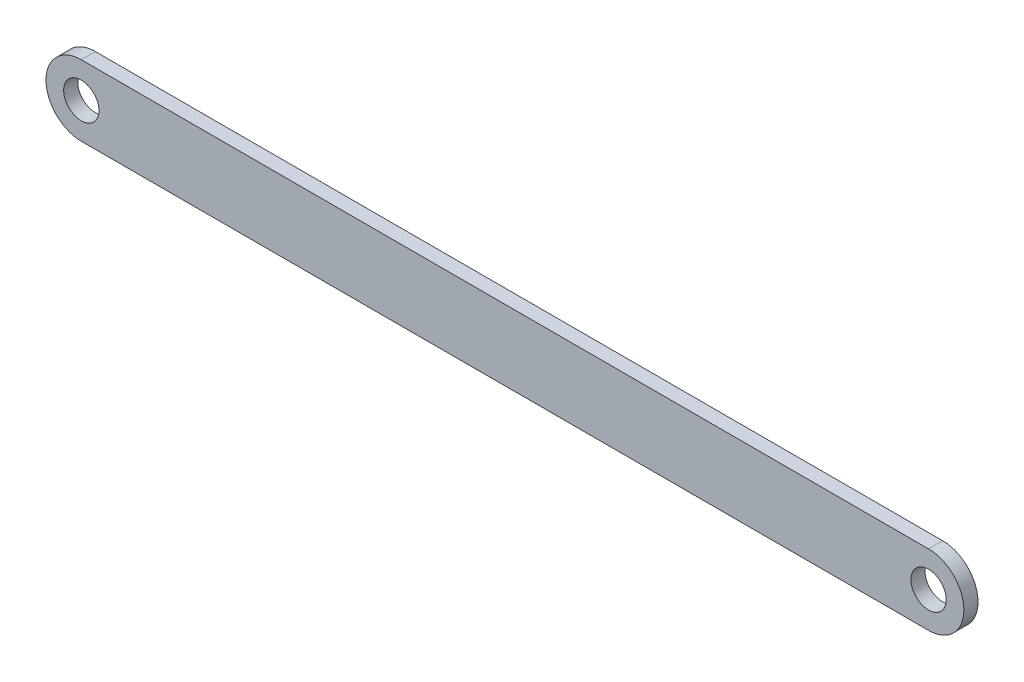
ISO-10303-21;
HEADER;
FILE_DESCRIPTION(('STEP AP214'),'2;1');
FILE_NAME('part.step','',(''),(''),'','','');
FILE_SCHEMA(('AUTOMOTIVE_DESIGN { 1 0 10303 214 1 1 1 1 }'));
ENDSEC;
DATA;
#1=APPLICATION_CONTEXT('core data for automotive mechanical design processes');
#2=APPLICATION_PROTOCOL_DEFINITION('international standard','automotive_design',2000,#1);
#3=PRODUCT_CONTEXT('',#1,'mechanical');
#4=PRODUCT('Part','Part','',(#3));
#5=PRODUCT_RELATED_PRODUCT_CATEGORY('part','',(#4));
#6=PRODUCT_DEFINITION_FORMATION('','',#4);
#7=PRODUCT_DEFINITION_CONTEXT('part definition',#1,'design');
#8=PRODUCT_DEFINITION('design','',#6,#7);
#9=PRODUCT_DEFINITION_SHAPE('','',#8);
#10=(LENGTH_UNIT() NAMED_UNIT(*) SI_UNIT(.MILLI.,.METRE.));
#11=(NAMED_UNIT(*) PLANE_ANGLE_UNIT() SI_UNIT($,.RADIAN.));
#12=(NAMED_UNIT(*) SI_UNIT($,.STERADIAN.) SOLID_ANGLE_UNIT());
#13=UNCERTAINTY_MEASURE_WITH_UNIT(LENGTH_MEASURE(1.E-05),#10,'distance_accuracy_value','');
#14=(GEOMETRIC_REPRESENTATION_CONTEXT(3) GLOBAL_UNCERTAINTY_ASSIGNED_CONTEXT((#13)) GLOBAL_UNIT_ASSIGNED_CONTEXT((#10,
#11,#12)) REPRESENTATION_CONTEXT('',''));
#15=CARTESIAN_POINT('',(0.,0.,0.));
#16=DIRECTION('',(0.,0.,1.));
#17=DIRECTION('',(1.,0.,0.));
#18=AXIS2_PLACEMENT_3D('',#15,#16,#17);
#19=CARTESIAN_POINT('',(76.2,0.,2.54));
#20=DIRECTION('',(0.,0.,1.));
#21=DIRECTION('',(1.,0.,0.));
#22=AXIS2_PLACEMENT_3D('',#19,#20,#21);
#23=PLANE('',#22);
#24=CARTESIAN_POINT('',(76.2,0.,2.54));
#25=DIRECTION('',(0.,0.,1.));
#26=DIRECTION('',(1.,0.,0.));
#27=AXIS2_PLACEMENT_3D('',#24,#25,#26);
#28=CIRCLE('',#27,3.175);
#29=CARTESIAN_POINT('',(79.375,0.,2.54));
#30=VERTEX_POINT('',#29);
#31=EDGE_CURVE('E100',#30,#30,#28,.T.);
#32=ORIENTED_EDGE('',*,*,#31,.F.);
#33=EDGE_LOOP('',(#32));
#34=FACE_BOUND('',#33,.T.);
#35=CARTESIAN_POINT('',(76.2,0.,2.54));
#36=DIRECTION('',(0.,0.,1.));
#37=DIRECTION('',(1.,0.,0.));
#38=AXIS2_PLACEMENT_3D('',#35,#36,#37);
#39=CIRCLE('',#38,6.35);
#40=CARTESIAN_POINT('',(76.2,-6.35,2.54));
#41=VERTEX_POINT('',#40);
#42=CARTESIAN_POINT('',(76.2,6.35,2.54));
#43=VERTEX_POINT('',#42);
#44=EDGE_CURVE('E85',#41,#43,#39,.T.);
#45=ORIENTED_EDGE('',*,*,#44,.T.);
#46=DIRECTION('',(-1.,0.,0.));
#47=VECTOR('',#46,1.);
#48=CARTESIAN_POINT('',(-76.2,6.35,2.54));
#49=LINE('',#48,#47);
#50=CARTESIAN_POINT('',(-76.2,6.35,2.54));
#51=VERTEX_POINT('',#50);
#52=EDGE_CURVE('E80',#43,#51,#49,.T.);
#53=ORIENTED_EDGE('',*,*,#52,.T.);
#54=CARTESIAN_POINT('',(-76.2,0.,2.54));
#55=DIRECTION('',(0.,0.,1.));
#56=DIRECTION('',(1.,0.,0.));
#57=AXIS2_PLACEMENT_3D('',#54,#55,#56);
#58=CIRCLE('',#57,6.35);
#59=CARTESIAN_POINT('',(-76.2,-6.35,2.54));
#60=VERTEX_POINT('',#59);
#61=EDGE_CURVE('E83',#51,#60,#58,.T.);
#62=ORIENTED_EDGE('',*,*,#61,.T.);
#63=DIRECTION('',(1.,0.,0.));
#64=VECTOR('',#63,1.);
#65=CARTESIAN_POINT('',(-76.2,-6.35,2.54));
#66=LINE('',#65,#64);
#67=EDGE_CURVE('E50',#60,#41,#66,.T.);
#68=ORIENTED_EDGE('',*,*,#67,.T.);
#69=EDGE_LOOP('',(#45,#53,#62,#68));
#70=FACE_BOUND('',#69,.T.);
#71=CARTESIAN_POINT('',(-76.2,0.,2.54));
#72=DIRECTION('',(0.,0.,1.));
#73=DIRECTION('',(1.,0.,0.));
#74=AXIS2_PLACEMENT_3D('',#71,#72,#73);
#75=CIRCLE('',#74,3.175);
#76=CARTESIAN_POINT('',(-73.025,0.,2.54));
#77=VERTEX_POINT('',#76);
#78=EDGE_CURVE('E115',#77,#77,#75,.T.);
#79=ORIENTED_EDGE('',*,*,#78,.F.);
#80=EDGE_LOOP('',(#79));
#81=FACE_BOUND('',#80,.T.);
#82=ADVANCED_FACE('F33',(#34,#70,#81),#23,.T.);
#83=CARTESIAN_POINT('',(76.2,0.,0.));
#84=DIRECTION('',(0.,0.,1.));
#85=DIRECTION('',(1.,0.,0.));
#86=AXIS2_PLACEMENT_3D('',#83,#84,#85);
#87=PLANE('',#86);
#88=CARTESIAN_POINT('',(76.2,0.,0.));
#89=DIRECTION('',(0.,0.,1.));
#90=DIRECTION('',(1.,0.,0.));
#91=AXIS2_PLACEMENT_3D('',#88,#89,#90);
#92=CIRCLE('',#91,6.35);
#93=CARTESIAN_POINT('',(76.2,-6.35,0.));
#94=VERTEX_POINT('',#93);
#95=CARTESIAN_POINT('',(76.2,6.35,0.));
#96=VERTEX_POINT('',#95);
#97=EDGE_CURVE('E97',#94,#96,#92,.T.);
#98=ORIENTED_EDGE('',*,*,#97,.F.);
#99=DIRECTION('',(1.,0.,0.));
#100=VECTOR('',#99,1.);
#101=CARTESIAN_POINT('',(-76.2,-6.35,0.));
#102=LINE('',#101,#100);
#103=CARTESIAN_POINT('',(-76.2,-6.35,0.));
#104=VERTEX_POINT('',#103);
#105=EDGE_CURVE('E73',#104,#94,#102,.T.);
#106=ORIENTED_EDGE('',*,*,#105,.F.);
#107=CARTESIAN_POINT('',(-76.2,0.,0.));
#108=DIRECTION('',(0.,0.,1.));
#109=DIRECTION('',(1.,0.,0.));
#110=AXIS2_PLACEMENT_3D('',#107,#108,#109);
#111=CIRCLE('',#110,6.35);
#112=CARTESIAN_POINT('',(-76.2,6.35,0.));
#113=VERTEX_POINT('',#112);
#114=EDGE_CURVE('E67',#113,#104,#111,.T.);
#115=ORIENTED_EDGE('',*,*,#114,.F.);
#116=DIRECTION('',(-1.,0.,0.));
#117=VECTOR('',#116,1.);
#118=CARTESIAN_POINT('',(-76.2,6.35,0.));
#119=LINE('',#118,#117);
#120=EDGE_CURVE('E89',#96,#113,#119,.T.);
#121=ORIENTED_EDGE('',*,*,#120,.F.);
#122=EDGE_LOOP('',(#98,#106,#115,#121));
#123=FACE_BOUND('',#122,.T.);
#124=CARTESIAN_POINT('',(76.2,0.,0.));
#125=DIRECTION('',(0.,0.,1.));
#126=DIRECTION('',(1.,0.,0.));
#127=AXIS2_PLACEMENT_3D('',#124,#125,#126);
#128=CIRCLE('',#127,3.175);
#129=CARTESIAN_POINT('',(79.375,0.,0.));
#130=VERTEX_POINT('',#129);
#131=EDGE_CURVE('E112',#130,#130,#128,.T.);
#132=ORIENTED_EDGE('',*,*,#131,.T.);
#133=EDGE_LOOP('',(#132));
#134=FACE_BOUND('',#133,.T.);
#135=CARTESIAN_POINT('',(-76.2,0.,0.));
#136=DIRECTION('',(0.,0.,1.));
#137=DIRECTION('',(1.,0.,0.));
#138=AXIS2_PLACEMENT_3D('',#135,#136,#137);
#139=CIRCLE('',#138,3.175);
#140=CARTESIAN_POINT('',(-73.025,0.,0.));
#141=VERTEX_POINT('',#140);
#142=EDGE_CURVE('E118',#141,#141,#139,.T.);
#143=ORIENTED_EDGE('',*,*,#142,.T.);
#144=EDGE_LOOP('',(#143));
#145=FACE_BOUND('',#144,.T.);
#146=ADVANCED_FACE('F108',(#123,#134,#145),#87,.F.);
#147=CARTESIAN_POINT('',(76.2,0.,2.54));
#148=DIRECTION('',(0.,0.,-1.));
#149=DIRECTION('',(-1.,0.,0.));
#150=AXIS2_PLACEMENT_3D('',#147,#148,#149);
#151=CYLINDRICAL_SURFACE('',#150,6.35);
#152=ORIENTED_EDGE('',*,*,#97,.T.);
#153=DIRECTION('',(0.,0.,-1.));
#154=VECTOR('',#153,1.);
#155=CARTESIAN_POINT('',(76.2,6.35,2.54));
#156=LINE('',#155,#154);
#157=EDGE_CURVE('E11',#43,#96,#156,.T.);
#158=ORIENTED_EDGE('',*,*,#157,.F.);
#159=ORIENTED_EDGE('',*,*,#44,.F.);
#160=DIRECTION('',(0.,0.,-1.));
#161=VECTOR('',#160,1.);
#162=CARTESIAN_POINT('',(76.2,-6.35,2.54));
#163=LINE('',#162,#161);
#164=EDGE_CURVE('E93',#41,#94,#163,.T.);
#165=ORIENTED_EDGE('',*,*,#164,.T.);
#166=EDGE_LOOP('',(#152,#158,#159,#165));
#167=FACE_BOUND('',#166,.T.);
#168=ADVANCED_FACE('F35',(#167),#151,.T.);
#169=CARTESIAN_POINT('',(-76.2,6.35,2.54));
#170=DIRECTION('',(0.,-1.,0.));
#171=DIRECTION('',(0.,0.,-1.));
#172=AXIS2_PLACEMENT_3D('',#169,#170,#171);
#173=PLANE('',#172);
#174=ORIENTED_EDGE('',*,*,#120,.T.);
#175=DIRECTION('',(0.,0.,-1.));
#176=VECTOR('',#175,1.);
#177=CARTESIAN_POINT('',(-76.2,6.35,2.54));
#178=LINE('',#177,#176);
#179=EDGE_CURVE('E42',#51,#113,#178,.T.);
#180=ORIENTED_EDGE('',*,*,#179,.F.);
#181=ORIENTED_EDGE('',*,*,#52,.F.);
#182=ORIENTED_EDGE('',*,*,#157,.T.);
#183=EDGE_LOOP('',(#174,#180,#181,#182));
#184=FACE_BOUND('',#183,.T.);
#185=ADVANCED_FACE('F88',(#184),#173,.F.);
#186=CARTESIAN_POINT('',(-76.2,0.,2.54));
#187=DIRECTION('',(0.,0.,-1.));
#188=DIRECTION('',(-1.,0.,0.));
#189=AXIS2_PLACEMENT_3D('',#186,#187,#188);
#190=CYLINDRICAL_SURFACE('',#189,6.35);
#191=ORIENTED_EDGE('',*,*,#114,.T.);
#192=DIRECTION('',(0.,0.,-1.));
#193=VECTOR('',#192,1.);
#194=CARTESIAN_POINT('',(-76.2,-6.35,2.54));
#195=LINE('',#194,#193);
#196=EDGE_CURVE('E90',#60,#104,#195,.T.);
#197=ORIENTED_EDGE('',*,*,#196,.F.);
#198=ORIENTED_EDGE('',*,*,#61,.F.);
#199=ORIENTED_EDGE('',*,*,#179,.T.);
#200=EDGE_LOOP('',(#191,#197,#198,#199));
#201=FACE_BOUND('',#200,.T.);
#202=ADVANCED_FACE('F91',(#201),#190,.T.);
#203=CARTESIAN_POINT('',(-76.2,-6.35,2.54));
#204=DIRECTION('',(0.,1.,0.));
#205=DIRECTION('',(0.,0.,1.));
#206=AXIS2_PLACEMENT_3D('',#203,#204,#205);
#207=PLANE('',#206);
#208=ORIENTED_EDGE('',*,*,#105,.T.);
#209=ORIENTED_EDGE('',*,*,#164,.F.);
#210=ORIENTED_EDGE('',*,*,#67,.F.);
#211=ORIENTED_EDGE('',*,*,#196,.T.);
#212=EDGE_LOOP('',(#208,#209,#210,#211));
#213=FACE_BOUND('',#212,.T.);
#214=ADVANCED_FACE('F105',(#213),#207,.F.);
#215=CARTESIAN_POINT('',(76.2,0.,2.54));
#216=DIRECTION('',(0.,0.,-1.));
#217=DIRECTION('',(-1.,0.,0.));
#218=AXIS2_PLACEMENT_3D('',#215,#216,#217);
#219=CYLINDRICAL_SURFACE('',#218,3.175);
#220=ORIENTED_EDGE('',*,*,#31,.T.);
#221=EDGE_LOOP('',(#220));
#222=FACE_BOUND('',#221,.T.);
#223=ORIENTED_EDGE('',*,*,#131,.F.);
#224=EDGE_LOOP('',(#223));
#225=FACE_BOUND('',#224,.T.);
#226=ADVANCED_FACE('F135',(#222,#225),#219,.F.);
#227=CARTESIAN_POINT('',(-76.2,0.,2.54));
#228=DIRECTION('',(0.,0.,-1.));
#229=DIRECTION('',(-1.,0.,0.));
#230=AXIS2_PLACEMENT_3D('',#227,#228,#229);
#231=CYLINDRICAL_SURFACE('',#230,3.175);
#232=ORIENTED_EDGE('',*,*,#78,.T.);
#233=EDGE_LOOP('',(#232));
#234=FACE_BOUND('',#233,.T.);
#235=ORIENTED_EDGE('',*,*,#142,.F.);
#236=EDGE_LOOP('',(#235));
#237=FACE_BOUND('',#236,.T.);
#238=ADVANCED_FACE('F124',(#234,#237),#231,.F.);
#239=CLOSED_SHELL('',(#82,#146,#168,#185,#202,#214,#226,#238));
#240=MANIFOLD_SOLID_BREP('B2',#239);
#241=ADVANCED_BREP_SHAPE_REPRESENTATION('',(#18,#240),#14);
#242=SHAPE_DEFINITION_REPRESENTATION(#9,#241);
ENDSEC;
END-ISO-10303-21;
